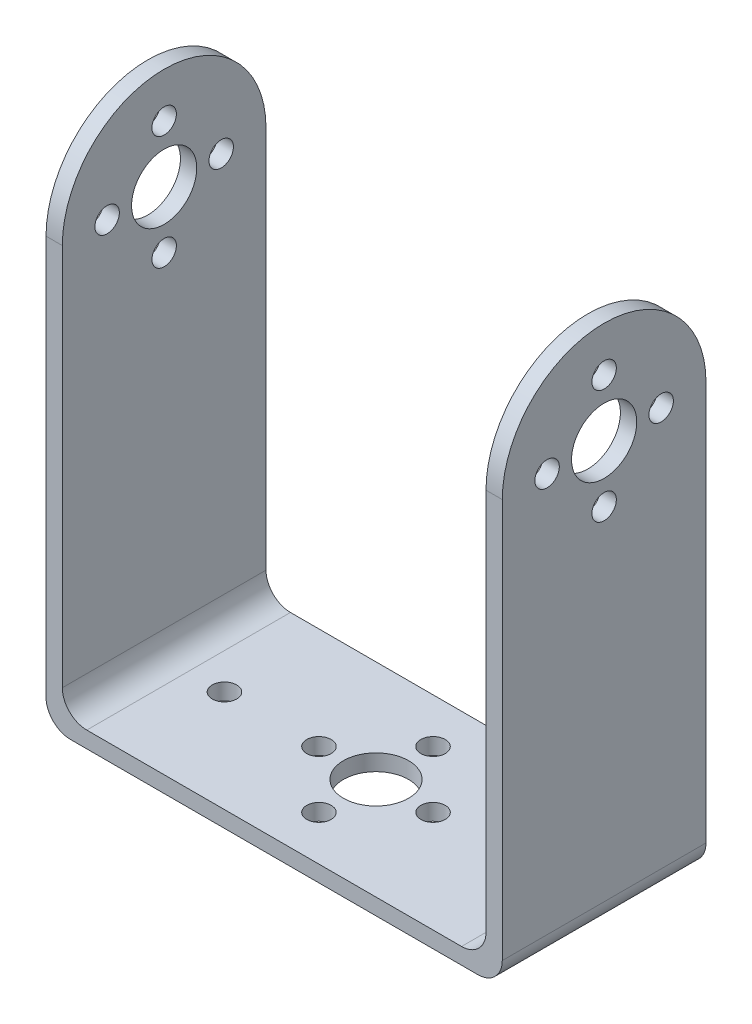
ISO-10303-21;
HEADER;
FILE_DESCRIPTION(('STEP AP214'),'2;1');
FILE_NAME('part.step','',(''),(''),'','','');
FILE_SCHEMA(('AUTOMOTIVE_DESIGN { 1 0 10303 214 1 1 1 1 }'));
ENDSEC;
DATA;
#1=APPLICATION_CONTEXT('core data for automotive mechanical design processes');
#2=APPLICATION_PROTOCOL_DEFINITION('international standard','automotive_design',2000,#1);
#3=PRODUCT_CONTEXT('',#1,'mechanical');
#4=PRODUCT('Part','Part','',(#3));
#5=PRODUCT_RELATED_PRODUCT_CATEGORY('part','',(#4));
#6=PRODUCT_DEFINITION_FORMATION('','',#4);
#7=PRODUCT_DEFINITION_CONTEXT('part definition',#1,'design');
#8=PRODUCT_DEFINITION('design','',#6,#7);
#9=PRODUCT_DEFINITION_SHAPE('','',#8);
#10=(LENGTH_UNIT() NAMED_UNIT(*) SI_UNIT(.MILLI.,.METRE.));
#11=(NAMED_UNIT(*) PLANE_ANGLE_UNIT() SI_UNIT($,.RADIAN.));
#12=(NAMED_UNIT(*) SI_UNIT($,.STERADIAN.) SOLID_ANGLE_UNIT());
#13=UNCERTAINTY_MEASURE_WITH_UNIT(LENGTH_MEASURE(1.E-05),#10,'distance_accuracy_value','');
#14=(GEOMETRIC_REPRESENTATION_CONTEXT(3) GLOBAL_UNCERTAINTY_ASSIGNED_CONTEXT((#13)) GLOBAL_UNIT_ASSIGNED_CONTEXT((#10,
#11,#12)) REPRESENTATION_CONTEXT('',''));
#15=CARTESIAN_POINT('',(0.,0.,0.));
#16=DIRECTION('',(0.,0.,1.));
#17=DIRECTION('',(1.,0.,0.));
#18=AXIS2_PLACEMENT_3D('',#15,#16,#17);
#19=CARTESIAN_POINT('',(0.,2.,25.));
#20=DIRECTION('',(0.,0.,-1.));
#21=DIRECTION('',(-1.,0.,0.));
#22=AXIS2_PLACEMENT_3D('',#19,#20,#21);
#23=PLANE('',#22);
#24=DIRECTION('',(1.,0.,0.));
#25=VECTOR('',#24,1.);
#26=CARTESIAN_POINT('',(0.,0.,25.));
#27=LINE('',#26,#25);
#28=CARTESIAN_POINT('',(1.,0.,25.));
#29=VERTEX_POINT('',#28);
#30=CARTESIAN_POINT('',(51.,0.,25.));
#31=VERTEX_POINT('',#30);
#32=EDGE_CURVE('E301',#29,#31,#27,.T.);
#33=ORIENTED_EDGE('',*,*,#32,.T.);
#34=CARTESIAN_POINT('',(51.,3.,25.));
#35=DIRECTION('',(0.,0.,-1.));
#36=DIRECTION('',(-1.,0.,0.));
#37=AXIS2_PLACEMENT_3D('',#34,#35,#36);
#38=CIRCLE('',#37,3.);
#39=CARTESIAN_POINT('',(54.,3.,25.));
#40=VERTEX_POINT('',#39);
#41=EDGE_CURVE('E333',#31,#40,#38,.F.);
#42=ORIENTED_EDGE('',*,*,#41,.T.);
#43=DIRECTION('',(0.,-1.,0.));
#44=VECTOR('',#43,1.);
#45=CARTESIAN_POINT('',(54.,64.5,25.));
#46=LINE('',#45,#44);
#47=CARTESIAN_POINT('',(54.,52.,25.));
#48=VERTEX_POINT('',#47);
#49=EDGE_CURVE('E240',#48,#40,#46,.T.);
#50=ORIENTED_EDGE('',*,*,#49,.F.);
#51=DIRECTION('',(-1.,0.,0.));
#52=VECTOR('',#51,1.);
#53=CARTESIAN_POINT('',(71.6776695296637,52.,25.));
#54=LINE('',#53,#52);
#55=CARTESIAN_POINT('',(52.,52.,25.));
#56=VERTEX_POINT('',#55);
#57=EDGE_CURVE('E221',#48,#56,#54,.T.);
#58=ORIENTED_EDGE('',*,*,#57,.T.);
#59=DIRECTION('',(0.,-1.,0.));
#60=VECTOR('',#59,1.);
#61=CARTESIAN_POINT('',(52.,64.5,25.));
#62=LINE('',#61,#60);
#63=CARTESIAN_POINT('',(52.,5.,25.));
#64=VERTEX_POINT('',#63);
#65=EDGE_CURVE('E242',#56,#64,#62,.T.);
#66=ORIENTED_EDGE('',*,*,#65,.T.);
#67=CARTESIAN_POINT('',(49.,5.,25.));
#68=DIRECTION('',(0.,0.,-1.));
#69=DIRECTION('',(-1.,0.,0.));
#70=AXIS2_PLACEMENT_3D('',#67,#68,#69);
#71=CIRCLE('',#70,3.);
#72=CARTESIAN_POINT('',(49.,2.,25.));
#73=VERTEX_POINT('',#72);
#74=EDGE_CURVE('E12',#64,#73,#71,.T.);
#75=ORIENTED_EDGE('',*,*,#74,.T.);
#76=DIRECTION('',(1.,0.,0.));
#77=VECTOR('',#76,1.);
#78=CARTESIAN_POINT('',(0.,2.,25.));
#79=LINE('',#78,#77);
#80=CARTESIAN_POINT('',(3.,2.,25.));
#81=VERTEX_POINT('',#80);
#82=EDGE_CURVE('E304',#81,#73,#79,.T.);
#83=ORIENTED_EDGE('',*,*,#82,.F.);
#84=CARTESIAN_POINT('',(3.,5.,25.));
#85=DIRECTION('',(0.,0.,-1.));
#86=DIRECTION('',(-1.,0.,0.));
#87=AXIS2_PLACEMENT_3D('',#84,#85,#86);
#88=CIRCLE('',#87,3.);
#89=CARTESIAN_POINT('',(0.,5.,25.));
#90=VERTEX_POINT('',#89);
#91=EDGE_CURVE('E338',#81,#90,#88,.T.);
#92=ORIENTED_EDGE('',*,*,#91,.T.);
#93=DIRECTION('',(0.,-1.,0.));
#94=VECTOR('',#93,1.);
#95=CARTESIAN_POINT('',(0.,64.5,25.));
#96=LINE('',#95,#94);
#97=CARTESIAN_POINT('',(0.,52.,25.));
#98=VERTEX_POINT('',#97);
#99=EDGE_CURVE('E249',#98,#90,#96,.T.);
#100=ORIENTED_EDGE('',*,*,#99,.F.);
#101=CARTESIAN_POINT('',(-2.,52.,25.));
#102=VERTEX_POINT('',#101);
#103=EDGE_CURVE('E369',#98,#102,#54,.T.);
#104=ORIENTED_EDGE('',*,*,#103,.T.);
#105=DIRECTION('',(0.,-1.,0.));
#106=VECTOR('',#105,1.);
#107=CARTESIAN_POINT('',(-2.,64.5,25.));
#108=LINE('',#107,#106);
#109=CARTESIAN_POINT('',(-2.,3.,25.));
#110=VERTEX_POINT('',#109);
#111=EDGE_CURVE('E252',#102,#110,#108,.T.);
#112=ORIENTED_EDGE('',*,*,#111,.T.);
#113=CARTESIAN_POINT('',(1.,3.,25.));
#114=DIRECTION('',(0.,0.,-1.));
#115=DIRECTION('',(-1.,0.,0.));
#116=AXIS2_PLACEMENT_3D('',#113,#114,#115);
#117=CIRCLE('',#116,3.);
#118=EDGE_CURVE('E147',#110,#29,#117,.F.);
#119=ORIENTED_EDGE('',*,*,#118,.T.);
#120=EDGE_LOOP('',(#33,#42,#50,#58,#66,#75,#83,#92,#100,#104,#112,#119));
#121=FACE_BOUND('',#120,.T.);
#122=ADVANCED_FACE('F124',(#121),#23,.F.);
#123=CARTESIAN_POINT('',(0.,64.5,25.));
#124=DIRECTION('',(-1.,0.,0.));
#125=DIRECTION('',(0.,0.,1.));
#126=AXIS2_PLACEMENT_3D('',#123,#124,#125);
#127=PLANE('',#126);
#128=CARTESIAN_POINT('',(0.,52.0000000000001,19.5000000000001));
#129=DIRECTION('',(-1.,0.,0.));
#130=DIRECTION('',(0.,0.,1.));
#131=AXIS2_PLACEMENT_3D('',#128,#129,#130);
#132=CIRCLE('',#131,1.5);
#133=CARTESIAN_POINT('',(0.,52.0000000000001,21.0000000000001));
#134=VERTEX_POINT('',#133);
#135=EDGE_CURVE('E372',#134,#134,#132,.T.);
#136=ORIENTED_EDGE('',*,*,#135,.T.);
#137=EDGE_LOOP('',(#136));
#138=FACE_BOUND('',#137,.T.);
#139=CARTESIAN_POINT('',(0.,52.,5.5000000000001));
#140=DIRECTION('',(-1.,0.,0.));
#141=DIRECTION('',(0.,0.,1.));
#142=AXIS2_PLACEMENT_3D('',#139,#140,#141);
#143=CIRCLE('',#142,1.5);
#144=CARTESIAN_POINT('',(0.,52.,7.0000000000001));
#145=VERTEX_POINT('',#144);
#146=EDGE_CURVE('E378',#145,#145,#143,.T.);
#147=ORIENTED_EDGE('',*,*,#146,.T.);
#148=EDGE_LOOP('',(#147));
#149=FACE_BOUND('',#148,.T.);
#150=CARTESIAN_POINT('',(0.,52.,12.5));
#151=DIRECTION('',(-1.,0.,0.));
#152=DIRECTION('',(0.,0.,1.));
#153=AXIS2_PLACEMENT_3D('',#150,#151,#152);
#154=CIRCLE('',#153,4.);
#155=CARTESIAN_POINT('',(0.,52.,16.5));
#156=VERTEX_POINT('',#155);
#157=EDGE_CURVE('E384',#156,#156,#154,.T.);
#158=ORIENTED_EDGE('',*,*,#157,.T.);
#159=EDGE_LOOP('',(#158));
#160=FACE_BOUND('',#159,.T.);
#161=CARTESIAN_POINT('',(0.,45.,12.5000000000001));
#162=DIRECTION('',(-1.,0.,0.));
#163=DIRECTION('',(0.,0.,1.));
#164=AXIS2_PLACEMENT_3D('',#161,#162,#163);
#165=CIRCLE('',#164,1.5);
#166=CARTESIAN_POINT('',(0.,45.,14.0000000000001));
#167=VERTEX_POINT('',#166);
#168=EDGE_CURVE('E390',#167,#167,#165,.T.);
#169=ORIENTED_EDGE('',*,*,#168,.T.);
#170=EDGE_LOOP('',(#169));
#171=FACE_BOUND('',#170,.T.);
#172=CARTESIAN_POINT('',(0.,59.,12.5));
#173=DIRECTION('',(-1.,0.,0.));
#174=DIRECTION('',(0.,0.,1.));
#175=AXIS2_PLACEMENT_3D('',#172,#173,#174);
#176=CIRCLE('',#175,1.5);
#177=CARTESIAN_POINT('',(0.,59.,14.));
#178=VERTEX_POINT('',#177);
#179=EDGE_CURVE('E396',#178,#178,#176,.T.);
#180=ORIENTED_EDGE('',*,*,#179,.T.);
#181=EDGE_LOOP('',(#180));
#182=FACE_BOUND('',#181,.T.);
#183=ORIENTED_EDGE('',*,*,#99,.T.);
#184=DIRECTION('',(0.,0.,1.));
#185=VECTOR('',#184,1.);
#186=CARTESIAN_POINT('',(0.,5.,25.));
#187=LINE('',#186,#185);
#188=CARTESIAN_POINT('',(0.,5.,0.));
#189=VERTEX_POINT('',#188);
#190=EDGE_CURVE('E321',#90,#189,#187,.F.);
#191=ORIENTED_EDGE('',*,*,#190,.T.);
#192=DIRECTION('',(0.,-1.,0.));
#193=VECTOR('',#192,1.);
#194=CARTESIAN_POINT('',(0.,64.5,0.));
#195=LINE('',#194,#193);
#196=CARTESIAN_POINT('',(0.,52.,0.));
#197=VERTEX_POINT('',#196);
#198=EDGE_CURVE('E258',#197,#189,#195,.T.);
#199=ORIENTED_EDGE('',*,*,#198,.F.);
#200=CARTESIAN_POINT('',(0.,52.,12.5));
#201=DIRECTION('',(-1.,0.,0.));
#202=DIRECTION('',(0.,0.,1.));
#203=AXIS2_PLACEMENT_3D('',#200,#201,#202);
#204=CIRCLE('',#203,12.5);
#205=EDGE_CURVE('E244',#197,#98,#204,.F.);
#206=ORIENTED_EDGE('',*,*,#205,.T.);
#207=EDGE_LOOP('',(#183,#191,#199,#206));
#208=FACE_BOUND('',#207,.T.);
#209=ADVANCED_FACE('F361',(#138,#149,#160,#171,#182,#208),#127,.F.);
#210=CARTESIAN_POINT('',(-2.,64.5,25.));
#211=DIRECTION('',(1.,0.,0.));
#212=DIRECTION('',(0.,0.,-1.));
#213=AXIS2_PLACEMENT_3D('',#210,#211,#212);
#214=PLANE('',#213);
#215=CARTESIAN_POINT('',(-2.,52.0000000000001,19.5000000000001));
#216=DIRECTION('',(-1.,0.,0.));
#217=DIRECTION('',(0.,0.,1.));
#218=AXIS2_PLACEMENT_3D('',#215,#216,#217);
#219=CIRCLE('',#218,1.5);
#220=CARTESIAN_POINT('',(-2.,52.0000000000001,21.0000000000001));
#221=VERTEX_POINT('',#220);
#222=EDGE_CURVE('E420',#221,#221,#219,.T.);
#223=ORIENTED_EDGE('',*,*,#222,.F.);
#224=EDGE_LOOP('',(#223));
#225=FACE_BOUND('',#224,.T.);
#226=CARTESIAN_POINT('',(-2.,52.,5.5000000000001));
#227=DIRECTION('',(-1.,0.,0.));
#228=DIRECTION('',(0.,0.,1.));
#229=AXIS2_PLACEMENT_3D('',#226,#227,#228);
#230=CIRCLE('',#229,1.5);
#231=CARTESIAN_POINT('',(-2.,52.,7.0000000000001));
#232=VERTEX_POINT('',#231);
#233=EDGE_CURVE('E415',#232,#232,#230,.T.);
#234=ORIENTED_EDGE('',*,*,#233,.F.);
#235=EDGE_LOOP('',(#234));
#236=FACE_BOUND('',#235,.T.);
#237=CARTESIAN_POINT('',(-2.,52.,12.5));
#238=DIRECTION('',(-1.,0.,0.));
#239=DIRECTION('',(0.,0.,1.));
#240=AXIS2_PLACEMENT_3D('',#237,#238,#239);
#241=CIRCLE('',#240,4.);
#242=CARTESIAN_POINT('',(-2.,52.,16.5));
#243=VERTEX_POINT('',#242);
#244=EDGE_CURVE('E401',#243,#243,#241,.T.);
#245=ORIENTED_EDGE('',*,*,#244,.F.);
#246=EDGE_LOOP('',(#245));
#247=FACE_BOUND('',#246,.T.);
#248=CARTESIAN_POINT('',(-2.,45.,12.5000000000001));
#249=DIRECTION('',(-1.,0.,0.));
#250=DIRECTION('',(0.,0.,1.));
#251=AXIS2_PLACEMENT_3D('',#248,#249,#250);
#252=CIRCLE('',#251,1.5);
#253=CARTESIAN_POINT('',(-2.,45.,14.0000000000001));
#254=VERTEX_POINT('',#253);
#255=EDGE_CURVE('E407',#254,#254,#252,.T.);
#256=ORIENTED_EDGE('',*,*,#255,.F.);
#257=EDGE_LOOP('',(#256));
#258=FACE_BOUND('',#257,.T.);
#259=CARTESIAN_POINT('',(-2.,59.,12.5));
#260=DIRECTION('',(-1.,0.,0.));
#261=DIRECTION('',(0.,0.,1.));
#262=AXIS2_PLACEMENT_3D('',#259,#260,#261);
#263=CIRCLE('',#262,1.5);
#264=CARTESIAN_POINT('',(-2.,59.,14.));
#265=VERTEX_POINT('',#264);
#266=EDGE_CURVE('E408',#265,#265,#263,.T.);
#267=ORIENTED_EDGE('',*,*,#266,.F.);
#268=EDGE_LOOP('',(#267));
#269=FACE_BOUND('',#268,.T.);
#270=DIRECTION('',(0.,-1.,0.));
#271=VECTOR('',#270,1.);
#272=CARTESIAN_POINT('',(-1.99999999999999,64.5,0.));
#273=LINE('',#272,#271);
#274=CARTESIAN_POINT('',(-1.99999999999999,52.,0.));
#275=VERTEX_POINT('',#274);
#276=CARTESIAN_POINT('',(-1.99999999999999,3.,0.));
#277=VERTEX_POINT('',#276);
#278=EDGE_CURVE('E255',#275,#277,#273,.T.);
#279=ORIENTED_EDGE('',*,*,#278,.T.);
#280=DIRECTION('',(0.,0.,1.));
#281=VECTOR('',#280,1.);
#282=CARTESIAN_POINT('',(-2.,3.,25.));
#283=LINE('',#282,#281);
#284=EDGE_CURVE('E336',#277,#110,#283,.T.);
#285=ORIENTED_EDGE('',*,*,#284,.T.);
#286=ORIENTED_EDGE('',*,*,#111,.F.);
#287=CARTESIAN_POINT('',(-2.,52.,12.5));
#288=DIRECTION('',(-1.,0.,0.));
#289=DIRECTION('',(0.,0.,1.));
#290=AXIS2_PLACEMENT_3D('',#287,#288,#289);
#291=CIRCLE('',#290,12.5);
#292=EDGE_CURVE('E370',#275,#102,#291,.F.);
#293=ORIENTED_EDGE('',*,*,#292,.F.);
#294=EDGE_LOOP('',(#279,#285,#286,#293));
#295=FACE_BOUND('',#294,.T.);
#296=ADVANCED_FACE('F455',(#225,#236,#247,#258,#269,#295),#214,.F.);
#297=CARTESIAN_POINT('',(52.,64.5,25.));
#298=DIRECTION('',(1.,0.,0.));
#299=DIRECTION('',(0.,0.,-1.));
#300=AXIS2_PLACEMENT_3D('',#297,#298,#299);
#301=PLANE('',#300);
#302=CARTESIAN_POINT('',(52.,52.0000000000001,19.5000000000001));
#303=DIRECTION('',(1.,0.,0.));
#304=DIRECTION('',(0.,0.,-1.));
#305=AXIS2_PLACEMENT_3D('',#302,#303,#304);
#306=CIRCLE('',#305,1.5);
#307=CARTESIAN_POINT('',(52.,52.0000000000001,18.0000000000001));
#308=VERTEX_POINT('',#307);
#309=EDGE_CURVE('E375',#308,#308,#306,.T.);
#310=ORIENTED_EDGE('',*,*,#309,.T.);
#311=EDGE_LOOP('',(#310));
#312=FACE_BOUND('',#311,.T.);
#313=CARTESIAN_POINT('',(52.,52.,5.5000000000001));
#314=DIRECTION('',(1.,0.,0.));
#315=DIRECTION('',(0.,0.,-1.));
#316=AXIS2_PLACEMENT_3D('',#313,#314,#315);
#317=CIRCLE('',#316,1.5);
#318=CARTESIAN_POINT('',(52.,52.,4.0000000000001));
#319=VERTEX_POINT('',#318);
#320=EDGE_CURVE('E381',#319,#319,#317,.T.);
#321=ORIENTED_EDGE('',*,*,#320,.T.);
#322=EDGE_LOOP('',(#321));
#323=FACE_BOUND('',#322,.T.);
#324=CARTESIAN_POINT('',(52.,52.,12.5));
#325=DIRECTION('',(1.,0.,0.));
#326=DIRECTION('',(0.,0.,-1.));
#327=AXIS2_PLACEMENT_3D('',#324,#325,#326);
#328=CIRCLE('',#327,4.);
#329=CARTESIAN_POINT('',(52.,52.,8.5));
#330=VERTEX_POINT('',#329);
#331=EDGE_CURVE('E387',#330,#330,#328,.T.);
#332=ORIENTED_EDGE('',*,*,#331,.T.);
#333=EDGE_LOOP('',(#332));
#334=FACE_BOUND('',#333,.T.);
#335=CARTESIAN_POINT('',(52.,45.,12.5000000000002));
#336=DIRECTION('',(1.,0.,0.));
#337=DIRECTION('',(0.,0.,-1.));
#338=AXIS2_PLACEMENT_3D('',#335,#336,#337);
#339=CIRCLE('',#338,1.5);
#340=CARTESIAN_POINT('',(52.,45.,11.0000000000002));
#341=VERTEX_POINT('',#340);
#342=EDGE_CURVE('E393',#341,#341,#339,.T.);
#343=ORIENTED_EDGE('',*,*,#342,.T.);
#344=EDGE_LOOP('',(#343));
#345=FACE_BOUND('',#344,.T.);
#346=CARTESIAN_POINT('',(52.,59.,12.5));
#347=DIRECTION('',(1.,0.,0.));
#348=DIRECTION('',(0.,0.,-1.));
#349=AXIS2_PLACEMENT_3D('',#346,#347,#348);
#350=CIRCLE('',#349,1.5);
#351=CARTESIAN_POINT('',(52.,59.,11.));
#352=VERTEX_POINT('',#351);
#353=EDGE_CURVE('E233',#352,#352,#350,.T.);
#354=ORIENTED_EDGE('',*,*,#353,.T.);
#355=EDGE_LOOP('',(#354));
#356=FACE_BOUND('',#355,.T.);
#357=DIRECTION('',(0.,-1.,0.));
#358=VECTOR('',#357,1.);
#359=CARTESIAN_POINT('',(52.,64.5,0.));
#360=LINE('',#359,#358);
#361=CARTESIAN_POINT('',(52.,52.,0.));
#362=VERTEX_POINT('',#361);
#363=CARTESIAN_POINT('',(52.,5.,0.));
#364=VERTEX_POINT('',#363);
#365=EDGE_CURVE('E232',#362,#364,#360,.T.);
#366=ORIENTED_EDGE('',*,*,#365,.T.);
#367=DIRECTION('',(0.,0.,-1.));
#368=VECTOR('',#367,1.);
#369=CARTESIAN_POINT('',(52.,5.,25.));
#370=LINE('',#369,#368);
#371=EDGE_CURVE('E139',#364,#64,#370,.F.);
#372=ORIENTED_EDGE('',*,*,#371,.T.);
#373=ORIENTED_EDGE('',*,*,#65,.F.);
#374=CARTESIAN_POINT('',(52.,52.,12.5));
#375=DIRECTION('',(1.,0.,0.));
#376=DIRECTION('',(0.,0.,-1.));
#377=AXIS2_PLACEMENT_3D('',#374,#375,#376);
#378=CIRCLE('',#377,12.5);
#379=EDGE_CURVE('E226',#56,#362,#378,.F.);
#380=ORIENTED_EDGE('',*,*,#379,.T.);
#381=EDGE_LOOP('',(#366,#372,#373,#380));
#382=FACE_BOUND('',#381,.T.);
#383=ADVANCED_FACE('F344',(#312,#323,#334,#345,#356,#382),#301,.F.);
#384=CARTESIAN_POINT('',(54.,64.5,25.));
#385=DIRECTION('',(-1.,0.,0.));
#386=DIRECTION('',(0.,0.,1.));
#387=AXIS2_PLACEMENT_3D('',#384,#385,#386);
#388=PLANE('',#387);
#389=CARTESIAN_POINT('',(54.,52.0000000000001,19.5000000000001));
#390=DIRECTION('',(-1.,0.,0.));
#391=DIRECTION('',(0.,0.,1.));
#392=AXIS2_PLACEMENT_3D('',#389,#390,#391);
#393=CIRCLE('',#392,1.5);
#394=CARTESIAN_POINT('',(54.,52.0000000000001,21.0000000000001));
#395=VERTEX_POINT('',#394);
#396=EDGE_CURVE('E424',#395,#395,#393,.F.);
#397=ORIENTED_EDGE('',*,*,#396,.F.);
#398=EDGE_LOOP('',(#397));
#399=FACE_BOUND('',#398,.T.);
#400=CARTESIAN_POINT('',(54.,52.,5.5000000000001));
#401=DIRECTION('',(-1.,0.,0.));
#402=DIRECTION('',(0.,0.,1.));
#403=AXIS2_PLACEMENT_3D('',#400,#401,#402);
#404=CIRCLE('',#403,1.5);
#405=CARTESIAN_POINT('',(54.,52.,7.0000000000001));
#406=VERTEX_POINT('',#405);
#407=EDGE_CURVE('E423',#406,#406,#404,.F.);
#408=ORIENTED_EDGE('',*,*,#407,.F.);
#409=EDGE_LOOP('',(#408));
#410=FACE_BOUND('',#409,.T.);
#411=CARTESIAN_POINT('',(54.,52.,12.5));
#412=DIRECTION('',(-1.,0.,0.));
#413=DIRECTION('',(0.,0.,1.));
#414=AXIS2_PLACEMENT_3D('',#411,#412,#413);
#415=CIRCLE('',#414,4.);
#416=CARTESIAN_POINT('',(54.,52.,16.5));
#417=VERTEX_POINT('',#416);
#418=EDGE_CURVE('E404',#417,#417,#415,.F.);
#419=ORIENTED_EDGE('',*,*,#418,.F.);
#420=EDGE_LOOP('',(#419));
#421=FACE_BOUND('',#420,.T.);
#422=CARTESIAN_POINT('',(54.,45.,12.5000000000002));
#423=DIRECTION('',(-1.,0.,0.));
#424=DIRECTION('',(0.,0.,1.));
#425=AXIS2_PLACEMENT_3D('',#422,#423,#424);
#426=CIRCLE('',#425,1.5);
#427=CARTESIAN_POINT('',(54.,45.,14.0000000000002));
#428=VERTEX_POINT('',#427);
#429=EDGE_CURVE('E411',#428,#428,#426,.F.);
#430=ORIENTED_EDGE('',*,*,#429,.F.);
#431=EDGE_LOOP('',(#430));
#432=FACE_BOUND('',#431,.T.);
#433=CARTESIAN_POINT('',(54.,59.,12.5));
#434=DIRECTION('',(-1.,0.,0.));
#435=DIRECTION('',(0.,0.,1.));
#436=AXIS2_PLACEMENT_3D('',#433,#434,#435);
#437=CIRCLE('',#436,1.5);
#438=CARTESIAN_POINT('',(54.,59.,14.));
#439=VERTEX_POINT('',#438);
#440=EDGE_CURVE('E412',#439,#439,#437,.F.);
#441=ORIENTED_EDGE('',*,*,#440,.F.);
#442=EDGE_LOOP('',(#441));
#443=FACE_BOUND('',#442,.T.);
#444=ORIENTED_EDGE('',*,*,#49,.T.);
#445=DIRECTION('',(0.,0.,-1.));
#446=VECTOR('',#445,1.);
#447=CARTESIAN_POINT('',(54.,3.,25.));
#448=LINE('',#447,#446);
#449=CARTESIAN_POINT('',(54.,3.,0.));
#450=VERTEX_POINT('',#449);
#451=EDGE_CURVE('E239',#40,#450,#448,.T.);
#452=ORIENTED_EDGE('',*,*,#451,.T.);
#453=DIRECTION('',(0.,-1.,0.));
#454=VECTOR('',#453,1.);
#455=CARTESIAN_POINT('',(54.,64.5,0.));
#456=LINE('',#455,#454);
#457=CARTESIAN_POINT('',(54.,52.,0.));
#458=VERTEX_POINT('',#457);
#459=EDGE_CURVE('E231',#458,#450,#456,.T.);
#460=ORIENTED_EDGE('',*,*,#459,.F.);
#461=CARTESIAN_POINT('',(54.,52.,12.5));
#462=DIRECTION('',(-1.,0.,0.));
#463=DIRECTION('',(0.,0.,1.));
#464=AXIS2_PLACEMENT_3D('',#461,#462,#463);
#465=CIRCLE('',#464,12.5);
#466=EDGE_CURVE('E215',#48,#458,#465,.T.);
#467=ORIENTED_EDGE('',*,*,#466,.F.);
#468=EDGE_LOOP('',(#444,#452,#460,#467));
#469=FACE_BOUND('',#468,.T.);
#470=ADVANCED_FACE('F237',(#399,#410,#421,#432,#443,#469),#388,.F.);
#471=CARTESIAN_POINT('',(0.,2.,0.));
#472=DIRECTION('',(0.,1.,0.));
#473=DIRECTION('',(0.,0.,1.));
#474=AXIS2_PLACEMENT_3D('',#471,#472,#473);
#475=PLANE('',#474);
#476=CARTESIAN_POINT('',(26.,2.,5.5));
#477=DIRECTION('',(0.,1.,0.));
#478=DIRECTION('',(0.,0.,1.));
#479=AXIS2_PLACEMENT_3D('',#476,#477,#478);
#480=CIRCLE('',#479,1.5);
#481=CARTESIAN_POINT('',(26.,2.,7.));
#482=VERTEX_POINT('',#481);
#483=EDGE_CURVE('E268',#482,#482,#480,.T.);
#484=ORIENTED_EDGE('',*,*,#483,.F.);
#485=EDGE_LOOP('',(#484));
#486=FACE_BOUND('',#485,.T.);
#487=CARTESIAN_POINT('',(7.39999999999999,2.,12.5));
#488=DIRECTION('',(0.,1.,0.));
#489=DIRECTION('',(0.,0.,-1.));
#490=AXIS2_PLACEMENT_3D('',#487,#488,#489);
#491=CIRCLE('',#490,1.5);
#492=CARTESIAN_POINT('',(7.39999999999999,2.,11.));
#493=VERTEX_POINT('',#492);
#494=EDGE_CURVE('E280',#493,#493,#491,.T.);
#495=ORIENTED_EDGE('',*,*,#494,.F.);
#496=EDGE_LOOP('',(#495));
#497=FACE_BOUND('',#496,.T.);
#498=CARTESIAN_POINT('',(26.,2.,12.5));
#499=DIRECTION('',(0.,1.,0.));
#500=DIRECTION('',(0.,0.,1.));
#501=AXIS2_PLACEMENT_3D('',#498,#499,#500);
#502=CIRCLE('',#501,4.);
#503=CARTESIAN_POINT('',(26.,2.,16.5));
#504=VERTEX_POINT('',#503);
#505=EDGE_CURVE('E292',#504,#504,#502,.T.);
#506=ORIENTED_EDGE('',*,*,#505,.F.);
#507=EDGE_LOOP('',(#506));
#508=FACE_BOUND('',#507,.T.);
#509=DIRECTION('',(-1.,0.,0.));
#510=VECTOR('',#509,1.);
#511=CARTESIAN_POINT('',(0.,2.,0.));
#512=LINE('',#511,#510);
#513=CARTESIAN_POINT('',(49.,2.,0.));
#514=VERTEX_POINT('',#513);
#515=CARTESIAN_POINT('',(3.,2.,0.));
#516=VERTEX_POINT('',#515);
#517=EDGE_CURVE('E307',#514,#516,#512,.T.);
#518=ORIENTED_EDGE('',*,*,#517,.T.);
#519=DIRECTION('',(0.,0.,1.));
#520=VECTOR('',#519,1.);
#521=CARTESIAN_POINT('',(3.,2.,0.));
#522=LINE('',#521,#520);
#523=EDGE_CURVE('E318',#516,#81,#522,.T.);
#524=ORIENTED_EDGE('',*,*,#523,.T.);
#525=ORIENTED_EDGE('',*,*,#82,.T.);
#526=DIRECTION('',(0.,0.,-1.));
#527=VECTOR('',#526,1.);
#528=CARTESIAN_POINT('',(49.,2.,0.));
#529=LINE('',#528,#527);
#530=EDGE_CURVE('E311',#73,#514,#529,.T.);
#531=ORIENTED_EDGE('',*,*,#530,.T.);
#532=EDGE_LOOP('',(#518,#524,#525,#531));
#533=FACE_BOUND('',#532,.T.);
#534=CARTESIAN_POINT('',(44.6,2.,12.5));
#535=DIRECTION('',(0.,1.,0.));
#536=DIRECTION('',(0.,0.,1.));
#537=AXIS2_PLACEMENT_3D('',#534,#535,#536);
#538=CIRCLE('',#537,1.5);
#539=CARTESIAN_POINT('',(44.6,2.,14.));
#540=VERTEX_POINT('',#539);
#541=EDGE_CURVE('E298',#540,#540,#538,.T.);
#542=ORIENTED_EDGE('',*,*,#541,.F.);
#543=EDGE_LOOP('',(#542));
#544=FACE_BOUND('',#543,.T.);
#545=CARTESIAN_POINT('',(26.,2.,19.5));
#546=DIRECTION('',(0.,1.,0.));
#547=DIRECTION('',(0.,0.,1.));
#548=AXIS2_PLACEMENT_3D('',#545,#546,#547);
#549=CIRCLE('',#548,1.5);
#550=CARTESIAN_POINT('',(26.,2.,21.));
#551=VERTEX_POINT('',#550);
#552=EDGE_CURVE('E286',#551,#551,#549,.T.);
#553=ORIENTED_EDGE('',*,*,#552,.F.);
#554=EDGE_LOOP('',(#553));
#555=FACE_BOUND('',#554,.T.);
#556=CARTESIAN_POINT('',(19.,2.,12.5));
#557=DIRECTION('',(0.,1.,0.));
#558=DIRECTION('',(0.,0.,1.));
#559=AXIS2_PLACEMENT_3D('',#556,#557,#558);
#560=CIRCLE('',#559,1.5);
#561=CARTESIAN_POINT('',(19.,2.,14.));
#562=VERTEX_POINT('',#561);
#563=EDGE_CURVE('E274',#562,#562,#560,.T.);
#564=ORIENTED_EDGE('',*,*,#563,.F.);
#565=EDGE_LOOP('',(#564));
#566=FACE_BOUND('',#565,.T.);
#567=CARTESIAN_POINT('',(33.,2.,12.5000000000001));
#568=DIRECTION('',(0.,1.,0.));
#569=DIRECTION('',(0.,0.,1.));
#570=AXIS2_PLACEMENT_3D('',#567,#568,#569);
#571=CIRCLE('',#570,1.5);
#572=CARTESIAN_POINT('',(33.,2.,14.0000000000001));
#573=VERTEX_POINT('',#572);
#574=EDGE_CURVE('E262',#573,#573,#571,.T.);
#575=ORIENTED_EDGE('',*,*,#574,.F.);
#576=EDGE_LOOP('',(#575));
#577=FACE_BOUND('',#576,.T.);
#578=ADVANCED_FACE('F350',(#486,#497,#508,#533,#544,#555,#566,#577),#475,.T.);
#579=CARTESIAN_POINT('',(0.,0.,0.));
#580=DIRECTION('',(0.,1.,0.));
#581=DIRECTION('',(0.,0.,1.));
#582=AXIS2_PLACEMENT_3D('',#579,#580,#581);
#583=PLANE('',#582);
#584=DIRECTION('',(-1.,0.,0.));
#585=VECTOR('',#584,1.);
#586=CARTESIAN_POINT('',(0.,0.,0.));
#587=LINE('',#586,#585);
#588=CARTESIAN_POINT('',(51.,0.,0.));
#589=VERTEX_POINT('',#588);
#590=CARTESIAN_POINT('',(1.,0.,0.));
#591=VERTEX_POINT('',#590);
#592=EDGE_CURVE('E308',#589,#591,#587,.T.);
#593=ORIENTED_EDGE('',*,*,#592,.F.);
#594=DIRECTION('',(0.,0.,-1.));
#595=VECTOR('',#594,1.);
#596=CARTESIAN_POINT('',(51.,0.,0.));
#597=LINE('',#596,#595);
#598=EDGE_CURVE('E330',#589,#31,#597,.F.);
#599=ORIENTED_EDGE('',*,*,#598,.T.);
#600=ORIENTED_EDGE('',*,*,#32,.F.);
#601=DIRECTION('',(0.,0.,1.));
#602=VECTOR('',#601,1.);
#603=CARTESIAN_POINT('',(1.00000000000001,0.,0.));
#604=LINE('',#603,#602);
#605=EDGE_CURVE('E328',#29,#591,#604,.F.);
#606=ORIENTED_EDGE('',*,*,#605,.T.);
#607=EDGE_LOOP('',(#593,#599,#600,#606));
#608=FACE_BOUND('',#607,.T.);
#609=CARTESIAN_POINT('',(44.6,0.,12.5));
#610=DIRECTION('',(0.,1.,0.));
#611=DIRECTION('',(0.,0.,1.));
#612=AXIS2_PLACEMENT_3D('',#609,#610,#611);
#613=CIRCLE('',#612,1.5);
#614=CARTESIAN_POINT('',(44.6,0.,14.));
#615=VERTEX_POINT('',#614);
#616=EDGE_CURVE('E295',#615,#615,#613,.T.);
#617=ORIENTED_EDGE('',*,*,#616,.T.);
#618=EDGE_LOOP('',(#617));
#619=FACE_BOUND('',#618,.T.);
#620=CARTESIAN_POINT('',(26.,0.,12.5));
#621=DIRECTION('',(0.,1.,0.));
#622=DIRECTION('',(0.,0.,1.));
#623=AXIS2_PLACEMENT_3D('',#620,#621,#622);
#624=CIRCLE('',#623,4.);
#625=CARTESIAN_POINT('',(26.,0.,16.5));
#626=VERTEX_POINT('',#625);
#627=EDGE_CURVE('E289',#626,#626,#624,.T.);
#628=ORIENTED_EDGE('',*,*,#627,.T.);
#629=EDGE_LOOP('',(#628));
#630=FACE_BOUND('',#629,.T.);
#631=CARTESIAN_POINT('',(26.,0.,19.5));
#632=DIRECTION('',(0.,1.,0.));
#633=DIRECTION('',(0.,0.,1.));
#634=AXIS2_PLACEMENT_3D('',#631,#632,#633);
#635=CIRCLE('',#634,1.5);
#636=CARTESIAN_POINT('',(26.,0.,21.));
#637=VERTEX_POINT('',#636);
#638=EDGE_CURVE('E283',#637,#637,#635,.T.);
#639=ORIENTED_EDGE('',*,*,#638,.T.);
#640=EDGE_LOOP('',(#639));
#641=FACE_BOUND('',#640,.T.);
#642=CARTESIAN_POINT('',(7.39999999999999,0.,12.5));
#643=DIRECTION('',(0.,1.,0.));
#644=DIRECTION('',(0.,0.,-1.));
#645=AXIS2_PLACEMENT_3D('',#642,#643,#644);
#646=CIRCLE('',#645,1.5);
#647=CARTESIAN_POINT('',(7.39999999999999,0.,11.));
#648=VERTEX_POINT('',#647);
#649=EDGE_CURVE('E277',#648,#648,#646,.T.);
#650=ORIENTED_EDGE('',*,*,#649,.T.);
#651=EDGE_LOOP('',(#650));
#652=FACE_BOUND('',#651,.T.);
#653=CARTESIAN_POINT('',(19.,0.,12.5));
#654=DIRECTION('',(0.,1.,0.));
#655=DIRECTION('',(0.,0.,1.));
#656=AXIS2_PLACEMENT_3D('',#653,#654,#655);
#657=CIRCLE('',#656,1.5);
#658=CARTESIAN_POINT('',(19.,0.,14.));
#659=VERTEX_POINT('',#658);
#660=EDGE_CURVE('E271',#659,#659,#657,.T.);
#661=ORIENTED_EDGE('',*,*,#660,.T.);
#662=EDGE_LOOP('',(#661));
#663=FACE_BOUND('',#662,.T.);
#664=CARTESIAN_POINT('',(26.,0.,5.5));
#665=DIRECTION('',(0.,1.,0.));
#666=DIRECTION('',(0.,0.,1.));
#667=AXIS2_PLACEMENT_3D('',#664,#665,#666);
#668=CIRCLE('',#667,1.5);
#669=CARTESIAN_POINT('',(26.,0.,7.));
#670=VERTEX_POINT('',#669);
#671=EDGE_CURVE('E265',#670,#670,#668,.T.);
#672=ORIENTED_EDGE('',*,*,#671,.T.);
#673=EDGE_LOOP('',(#672));
#674=FACE_BOUND('',#673,.T.);
#675=CARTESIAN_POINT('',(33.,0.,12.5000000000001));
#676=DIRECTION('',(0.,1.,0.));
#677=DIRECTION('',(0.,0.,1.));
#678=AXIS2_PLACEMENT_3D('',#675,#676,#677);
#679=CIRCLE('',#678,1.5);
#680=CARTESIAN_POINT('',(33.,0.,14.0000000000001));
#681=VERTEX_POINT('',#680);
#682=EDGE_CURVE('E261',#681,#681,#679,.T.);
#683=ORIENTED_EDGE('',*,*,#682,.T.);
#684=EDGE_LOOP('',(#683));
#685=FACE_BOUND('',#684,.T.);
#686=ADVANCED_FACE('F633',(#608,#619,#630,#641,#652,#663,#674,#685),#583,.F.);
#687=CARTESIAN_POINT('',(0.,2.,0.));
#688=DIRECTION('',(0.,0.,1.));
#689=DIRECTION('',(1.,0.,0.));
#690=AXIS2_PLACEMENT_3D('',#687,#688,#689);
#691=PLANE('',#690);
#692=ORIENTED_EDGE('',*,*,#459,.T.);
#693=CARTESIAN_POINT('',(51.,3.,0.));
#694=DIRECTION('',(0.,0.,1.));
#695=DIRECTION('',(1.,0.,0.));
#696=AXIS2_PLACEMENT_3D('',#693,#694,#695);
#697=CIRCLE('',#696,3.);
#698=EDGE_CURVE('E326',#450,#589,#697,.F.);
#699=ORIENTED_EDGE('',*,*,#698,.T.);
#700=ORIENTED_EDGE('',*,*,#592,.T.);
#701=CARTESIAN_POINT('',(1.00000000000001,3.,0.));
#702=DIRECTION('',(0.,0.,1.));
#703=DIRECTION('',(1.,0.,0.));
#704=AXIS2_PLACEMENT_3D('',#701,#702,#703);
#705=CIRCLE('',#704,3.);
#706=EDGE_CURVE('E324',#591,#277,#705,.F.);
#707=ORIENTED_EDGE('',*,*,#706,.T.);
#708=ORIENTED_EDGE('',*,*,#278,.F.);
#709=DIRECTION('',(-1.,0.,0.));
#710=VECTOR('',#709,1.);
#711=CARTESIAN_POINT('',(71.6776695296637,52.,0.));
#712=LINE('',#711,#710);
#713=EDGE_CURVE('E234',#197,#275,#712,.T.);
#714=ORIENTED_EDGE('',*,*,#713,.F.);
#715=ORIENTED_EDGE('',*,*,#198,.T.);
#716=CARTESIAN_POINT('',(3.,5.,0.));
#717=DIRECTION('',(0.,0.,1.));
#718=DIRECTION('',(1.,0.,0.));
#719=AXIS2_PLACEMENT_3D('',#716,#717,#718);
#720=CIRCLE('',#719,3.);
#721=EDGE_CURVE('E340',#189,#516,#720,.T.);
#722=ORIENTED_EDGE('',*,*,#721,.T.);
#723=ORIENTED_EDGE('',*,*,#517,.F.);
#724=CARTESIAN_POINT('',(49.,5.,0.));
#725=DIRECTION('',(0.,0.,1.));
#726=DIRECTION('',(1.,0.,0.));
#727=AXIS2_PLACEMENT_3D('',#724,#725,#726);
#728=CIRCLE('',#727,3.);
#729=EDGE_CURVE('E132',#514,#364,#728,.T.);
#730=ORIENTED_EDGE('',*,*,#729,.T.);
#731=ORIENTED_EDGE('',*,*,#365,.F.);
#732=EDGE_CURVE('E218',#458,#362,#712,.T.);
#733=ORIENTED_EDGE('',*,*,#732,.F.);
#734=EDGE_LOOP('',(#692,#699,#700,#707,#708,#714,#715,#722,#723,#730,#731,#733));
#735=FACE_BOUND('',#734,.T.);
#736=ADVANCED_FACE('F230',(#735),#691,.F.);
#737=CARTESIAN_POINT('',(44.6,2.,12.5));
#738=DIRECTION('',(0.,-1.,0.));
#739=DIRECTION('',(0.,0.,-1.));
#740=AXIS2_PLACEMENT_3D('',#737,#738,#739);
#741=CYLINDRICAL_SURFACE('',#740,1.5);
#742=ORIENTED_EDGE('',*,*,#541,.T.);
#743=EDGE_LOOP('',(#742));
#744=FACE_BOUND('',#743,.T.);
#745=ORIENTED_EDGE('',*,*,#616,.F.);
#746=EDGE_LOOP('',(#745));
#747=FACE_BOUND('',#746,.T.);
#748=ADVANCED_FACE('F614',(#744,#747),#741,.F.);
#749=CARTESIAN_POINT('',(26.,2.,12.5));
#750=DIRECTION('',(0.,-1.,0.));
#751=DIRECTION('',(0.,0.,-1.));
#752=AXIS2_PLACEMENT_3D('',#749,#750,#751);
#753=CYLINDRICAL_SURFACE('',#752,4.);
#754=ORIENTED_EDGE('',*,*,#505,.T.);
#755=EDGE_LOOP('',(#754));
#756=FACE_BOUND('',#755,.T.);
#757=ORIENTED_EDGE('',*,*,#627,.F.);
#758=EDGE_LOOP('',(#757));
#759=FACE_BOUND('',#758,.T.);
#760=ADVANCED_FACE('F604',(#756,#759),#753,.F.);
#761=CARTESIAN_POINT('',(26.,2.,19.5));
#762=DIRECTION('',(0.,-1.,0.));
#763=DIRECTION('',(0.,0.,-1.));
#764=AXIS2_PLACEMENT_3D('',#761,#762,#763);
#765=CYLINDRICAL_SURFACE('',#764,1.5);
#766=ORIENTED_EDGE('',*,*,#552,.T.);
#767=EDGE_LOOP('',(#766));
#768=FACE_BOUND('',#767,.T.);
#769=ORIENTED_EDGE('',*,*,#638,.F.);
#770=EDGE_LOOP('',(#769));
#771=FACE_BOUND('',#770,.T.);
#772=ADVANCED_FACE('F594',(#768,#771),#765,.F.);
#773=CARTESIAN_POINT('',(7.39999999999999,2.,12.5));
#774=DIRECTION('',(0.,-1.,0.));
#775=DIRECTION('',(0.,0.,-1.));
#776=AXIS2_PLACEMENT_3D('',#773,#774,#775);
#777=CYLINDRICAL_SURFACE('',#776,1.5);
#778=ORIENTED_EDGE('',*,*,#494,.T.);
#779=EDGE_LOOP('',(#778));
#780=FACE_BOUND('',#779,.T.);
#781=ORIENTED_EDGE('',*,*,#649,.F.);
#782=EDGE_LOOP('',(#781));
#783=FACE_BOUND('',#782,.T.);
#784=ADVANCED_FACE('F584',(#780,#783),#777,.F.);
#785=CARTESIAN_POINT('',(19.,2.,12.5));
#786=DIRECTION('',(0.,-1.,0.));
#787=DIRECTION('',(0.,0.,-1.));
#788=AXIS2_PLACEMENT_3D('',#785,#786,#787);
#789=CYLINDRICAL_SURFACE('',#788,1.5);
#790=ORIENTED_EDGE('',*,*,#563,.T.);
#791=EDGE_LOOP('',(#790));
#792=FACE_BOUND('',#791,.T.);
#793=ORIENTED_EDGE('',*,*,#660,.F.);
#794=EDGE_LOOP('',(#793));
#795=FACE_BOUND('',#794,.T.);
#796=ADVANCED_FACE('F574',(#792,#795),#789,.F.);
#797=CARTESIAN_POINT('',(26.,2.,5.5));
#798=DIRECTION('',(0.,-1.,0.));
#799=DIRECTION('',(0.,0.,-1.));
#800=AXIS2_PLACEMENT_3D('',#797,#798,#799);
#801=CYLINDRICAL_SURFACE('',#800,1.5);
#802=ORIENTED_EDGE('',*,*,#483,.T.);
#803=EDGE_LOOP('',(#802));
#804=FACE_BOUND('',#803,.T.);
#805=ORIENTED_EDGE('',*,*,#671,.F.);
#806=EDGE_LOOP('',(#805));
#807=FACE_BOUND('',#806,.T.);
#808=ADVANCED_FACE('F563',(#804,#807),#801,.F.);
#809=CARTESIAN_POINT('',(33.,2.,12.5000000000001));
#810=DIRECTION('',(0.,-1.,0.));
#811=DIRECTION('',(0.,0.,-1.));
#812=AXIS2_PLACEMENT_3D('',#809,#810,#811);
#813=CYLINDRICAL_SURFACE('',#812,1.5);
#814=ORIENTED_EDGE('',*,*,#574,.T.);
#815=EDGE_LOOP('',(#814));
#816=FACE_BOUND('',#815,.T.);
#817=ORIENTED_EDGE('',*,*,#682,.F.);
#818=EDGE_LOOP('',(#817));
#819=FACE_BOUND('',#818,.T.);
#820=ADVANCED_FACE('F496',(#816,#819),#813,.F.);
#821=CARTESIAN_POINT('',(71.6776695296637,52.,12.5));
#822=DIRECTION('',(-1.,0.,0.));
#823=DIRECTION('',(0.,0.,1.));
#824=AXIS2_PLACEMENT_3D('',#821,#822,#823);
#825=CYLINDRICAL_SURFACE('',#824,12.5);
#826=ORIENTED_EDGE('',*,*,#57,.F.);
#827=ORIENTED_EDGE('',*,*,#466,.T.);
#828=ORIENTED_EDGE('',*,*,#732,.T.);
#829=ORIENTED_EDGE('',*,*,#379,.F.);
#830=EDGE_LOOP('',(#826,#827,#828,#829));
#831=FACE_BOUND('',#830,.T.);
#832=ADVANCED_FACE('F217',(#831),#825,.T.);
#833=ORIENTED_EDGE('',*,*,#205,.F.);
#834=ORIENTED_EDGE('',*,*,#713,.T.);
#835=ORIENTED_EDGE('',*,*,#292,.T.);
#836=ORIENTED_EDGE('',*,*,#103,.F.);
#837=EDGE_LOOP('',(#833,#834,#835,#836));
#838=FACE_BOUND('',#837,.T.);
#839=ADVANCED_FACE('F449',(#838),#825,.T.);
#840=CARTESIAN_POINT('',(71.6776695296637,59.,12.5));
#841=DIRECTION('',(-1.,0.,0.));
#842=DIRECTION('',(0.,0.,1.));
#843=AXIS2_PLACEMENT_3D('',#840,#841,#842);
#844=CYLINDRICAL_SURFACE('',#843,1.5);
#845=ORIENTED_EDGE('',*,*,#440,.T.);
#846=EDGE_LOOP('',(#845));
#847=FACE_BOUND('',#846,.T.);
#848=ORIENTED_EDGE('',*,*,#353,.F.);
#849=EDGE_LOOP('',(#848));
#850=FACE_BOUND('',#849,.T.);
#851=ADVANCED_FACE('F445',(#847,#850),#844,.F.);
#852=CARTESIAN_POINT('',(71.6776695296637,45.,12.5000000000002));
#853=DIRECTION('',(-1.,0.,0.));
#854=DIRECTION('',(0.,0.,1.));
#855=AXIS2_PLACEMENT_3D('',#852,#853,#854);
#856=CYLINDRICAL_SURFACE('',#855,1.5);
#857=ORIENTED_EDGE('',*,*,#429,.T.);
#858=EDGE_LOOP('',(#857));
#859=FACE_BOUND('',#858,.T.);
#860=ORIENTED_EDGE('',*,*,#342,.F.);
#861=EDGE_LOOP('',(#860));
#862=FACE_BOUND('',#861,.T.);
#863=ADVANCED_FACE('F448',(#859,#862),#856,.F.);
#864=CARTESIAN_POINT('',(71.6776695296637,52.,12.5));
#865=DIRECTION('',(-1.,0.,0.));
#866=DIRECTION('',(0.,0.,1.));
#867=AXIS2_PLACEMENT_3D('',#864,#865,#866);
#868=CYLINDRICAL_SURFACE('',#867,4.);
#869=ORIENTED_EDGE('',*,*,#418,.T.);
#870=EDGE_LOOP('',(#869));
#871=FACE_BOUND('',#870,.T.);
#872=ORIENTED_EDGE('',*,*,#331,.F.);
#873=EDGE_LOOP('',(#872));
#874=FACE_BOUND('',#873,.T.);
#875=ADVANCED_FACE('F503',(#871,#874),#868,.F.);
#876=CARTESIAN_POINT('',(71.6776695296637,52.,5.5000000000001));
#877=DIRECTION('',(-1.,0.,0.));
#878=DIRECTION('',(0.,0.,1.));
#879=AXIS2_PLACEMENT_3D('',#876,#877,#878);
#880=CYLINDRICAL_SURFACE('',#879,1.5);
#881=ORIENTED_EDGE('',*,*,#407,.T.);
#882=EDGE_LOOP('',(#881));
#883=FACE_BOUND('',#882,.T.);
#884=ORIENTED_EDGE('',*,*,#320,.F.);
#885=EDGE_LOOP('',(#884));
#886=FACE_BOUND('',#885,.T.);
#887=ADVANCED_FACE('F432',(#883,#886),#880,.F.);
#888=CARTESIAN_POINT('',(71.6776695296637,52.0000000000001,19.5000000000001));
#889=DIRECTION('',(-1.,0.,0.));
#890=DIRECTION('',(0.,0.,1.));
#891=AXIS2_PLACEMENT_3D('',#888,#889,#890);
#892=CYLINDRICAL_SURFACE('',#891,1.5);
#893=ORIENTED_EDGE('',*,*,#396,.T.);
#894=EDGE_LOOP('',(#893));
#895=FACE_BOUND('',#894,.T.);
#896=ORIENTED_EDGE('',*,*,#309,.F.);
#897=EDGE_LOOP('',(#896));
#898=FACE_BOUND('',#897,.T.);
#899=ADVANCED_FACE('F506',(#895,#898),#892,.F.);
#900=ORIENTED_EDGE('',*,*,#266,.T.);
#901=EDGE_LOOP('',(#900));
#902=FACE_BOUND('',#901,.T.);
#903=ORIENTED_EDGE('',*,*,#179,.F.);
#904=EDGE_LOOP('',(#903));
#905=FACE_BOUND('',#904,.T.);
#906=ADVANCED_FACE('F451',(#902,#905),#844,.F.);
#907=ORIENTED_EDGE('',*,*,#255,.T.);
#908=EDGE_LOOP('',(#907));
#909=FACE_BOUND('',#908,.T.);
#910=ORIENTED_EDGE('',*,*,#168,.F.);
#911=EDGE_LOOP('',(#910));
#912=FACE_BOUND('',#911,.T.);
#913=ADVANCED_FACE('F501',(#909,#912),#856,.F.);
#914=ORIENTED_EDGE('',*,*,#244,.T.);
#915=EDGE_LOOP('',(#914));
#916=FACE_BOUND('',#915,.T.);
#917=ORIENTED_EDGE('',*,*,#157,.F.);
#918=EDGE_LOOP('',(#917));
#919=FACE_BOUND('',#918,.T.);
#920=ADVANCED_FACE('F498',(#916,#919),#868,.F.);
#921=ORIENTED_EDGE('',*,*,#233,.T.);
#922=EDGE_LOOP('',(#921));
#923=FACE_BOUND('',#922,.T.);
#924=ORIENTED_EDGE('',*,*,#146,.F.);
#925=EDGE_LOOP('',(#924));
#926=FACE_BOUND('',#925,.T.);
#927=ADVANCED_FACE('F500',(#923,#926),#880,.F.);
#928=ORIENTED_EDGE('',*,*,#222,.T.);
#929=EDGE_LOOP('',(#928));
#930=FACE_BOUND('',#929,.T.);
#931=ORIENTED_EDGE('',*,*,#135,.F.);
#932=EDGE_LOOP('',(#931));
#933=FACE_BOUND('',#932,.T.);
#934=ADVANCED_FACE('F477',(#930,#933),#892,.F.);
#935=CARTESIAN_POINT('',(3.,5.,0.));
#936=DIRECTION('',(0.,0.,1.));
#937=DIRECTION('',(1.,0.,0.));
#938=AXIS2_PLACEMENT_3D('',#935,#936,#937);
#939=CYLINDRICAL_SURFACE('',#938,3.);
#940=ORIENTED_EDGE('',*,*,#721,.F.);
#941=ORIENTED_EDGE('',*,*,#190,.F.);
#942=ORIENTED_EDGE('',*,*,#91,.F.);
#943=ORIENTED_EDGE('',*,*,#523,.F.);
#944=EDGE_LOOP('',(#940,#941,#942,#943));
#945=FACE_BOUND('',#944,.T.);
#946=ADVANCED_FACE('F355',(#945),#939,.F.);
#947=CARTESIAN_POINT('',(51.,3.,25.));
#948=DIRECTION('',(0.,0.,-1.));
#949=DIRECTION('',(-1.,0.,0.));
#950=AXIS2_PLACEMENT_3D('',#947,#948,#949);
#951=CYLINDRICAL_SURFACE('',#950,3.);
#952=ORIENTED_EDGE('',*,*,#41,.F.);
#953=ORIENTED_EDGE('',*,*,#598,.F.);
#954=ORIENTED_EDGE('',*,*,#698,.F.);
#955=ORIENTED_EDGE('',*,*,#451,.F.);
#956=EDGE_LOOP('',(#952,#953,#954,#955));
#957=FACE_BOUND('',#956,.T.);
#958=ADVANCED_FACE('F476',(#957),#951,.T.);
#959=CARTESIAN_POINT('',(49.,5.,0.));
#960=DIRECTION('',(0.,0.,-1.));
#961=DIRECTION('',(-1.,0.,0.));
#962=AXIS2_PLACEMENT_3D('',#959,#960,#961);
#963=CYLINDRICAL_SURFACE('',#962,3.);
#964=ORIENTED_EDGE('',*,*,#74,.F.);
#965=ORIENTED_EDGE('',*,*,#371,.F.);
#966=ORIENTED_EDGE('',*,*,#729,.F.);
#967=ORIENTED_EDGE('',*,*,#530,.F.);
#968=EDGE_LOOP('',(#964,#965,#966,#967));
#969=FACE_BOUND('',#968,.T.);
#970=ADVANCED_FACE('F346',(#969),#963,.F.);
#971=CARTESIAN_POINT('',(1.,3.,25.));
#972=DIRECTION('',(0.,0.,1.));
#973=DIRECTION('',(1.,0.,0.));
#974=AXIS2_PLACEMENT_3D('',#971,#972,#973);
#975=CYLINDRICAL_SURFACE('',#974,3.);
#976=ORIENTED_EDGE('',*,*,#706,.F.);
#977=ORIENTED_EDGE('',*,*,#605,.F.);
#978=ORIENTED_EDGE('',*,*,#118,.F.);
#979=ORIENTED_EDGE('',*,*,#284,.F.);
#980=EDGE_LOOP('',(#976,#977,#978,#979));
#981=FACE_BOUND('',#980,.T.);
#982=ADVANCED_FACE('F126',(#981),#975,.T.);
#983=CLOSED_SHELL('',(#122,#209,#296,#383,#470,#578,#686,#736,#748,#760,#772,#784,#796,#808,
#820,#832,#839,#851,#863,#875,#887,#899,#906,#913,#920,#927,#934,#946,#958,#970,#982));
#984=MANIFOLD_SOLID_BREP('B2',#983);
#985=ADVANCED_BREP_SHAPE_REPRESENTATION('',(#18,#984),#14);
#986=SHAPE_DEFINITION_REPRESENTATION(#9,#985);
ENDSEC;
END-ISO-10303-21;
